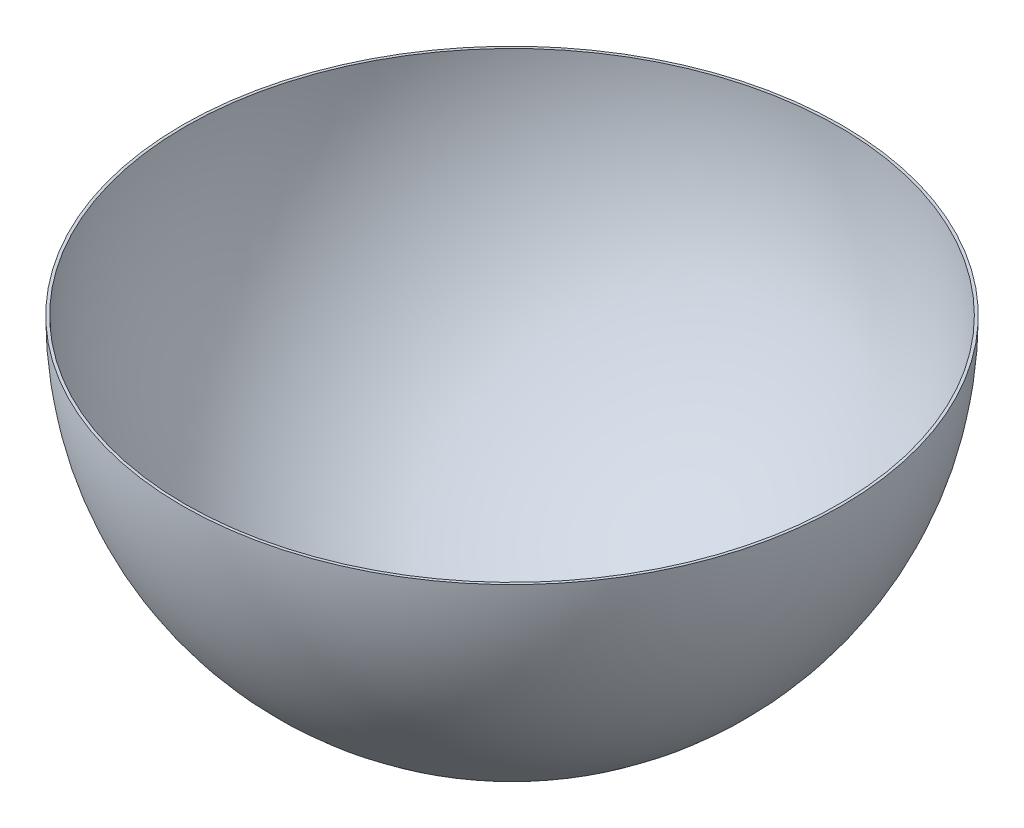
ISO-10303-21;
HEADER;
FILE_DESCRIPTION(('STEP AP214'),'2;1');
FILE_NAME('part.step','',(''),(''),'','','');
FILE_SCHEMA(('AUTOMOTIVE_DESIGN { 1 0 10303 214 1 1 1 1 }'));
ENDSEC;
DATA;
#1=APPLICATION_CONTEXT('core data for automotive mechanical design processes');
#2=APPLICATION_PROTOCOL_DEFINITION('international standard','automotive_design',2000,#1);
#3=PRODUCT_CONTEXT('',#1,'mechanical');
#4=PRODUCT('Part','Part','',(#3));
#5=PRODUCT_RELATED_PRODUCT_CATEGORY('part','',(#4));
#6=PRODUCT_DEFINITION_FORMATION('','',#4);
#7=PRODUCT_DEFINITION_CONTEXT('part definition',#1,'design');
#8=PRODUCT_DEFINITION('design','',#6,#7);
#9=PRODUCT_DEFINITION_SHAPE('','',#8);
#10=(LENGTH_UNIT() NAMED_UNIT(*) SI_UNIT(.MILLI.,.METRE.));
#11=(NAMED_UNIT(*) PLANE_ANGLE_UNIT() SI_UNIT($,.RADIAN.));
#12=(NAMED_UNIT(*) SI_UNIT($,.STERADIAN.) SOLID_ANGLE_UNIT());
#13=UNCERTAINTY_MEASURE_WITH_UNIT(LENGTH_MEASURE(1.E-05),#10,'distance_accuracy_value','');
#14=(GEOMETRIC_REPRESENTATION_CONTEXT(3) GLOBAL_UNCERTAINTY_ASSIGNED_CONTEXT((#13)) GLOBAL_UNIT_ASSIGNED_CONTEXT((#10,
#11,#12)) REPRESENTATION_CONTEXT('',''));
#15=CARTESIAN_POINT('',(0.,0.,0.));
#16=DIRECTION('',(0.,0.,1.));
#17=DIRECTION('',(1.,0.,0.));
#18=AXIS2_PLACEMENT_3D('',#15,#16,#17);
#19=CARTESIAN_POINT('',(0.,0.,0.));
#20=DIRECTION('',(0.,0.,1.));
#21=DIRECTION('',(1.,0.,0.));
#22=AXIS2_PLACEMENT_3D('',#19,#20,#21);
#23=SPHERICAL_SURFACE('',#22,228.6);
#24=CARTESIAN_POINT('',(0.,0.,0.));
#25=DIRECTION('',(0.,1.,0.));
#26=DIRECTION('',(-1.,0.,0.));
#27=AXIS2_PLACEMENT_3D('',#24,#25,#26);
#28=SPHERICAL_SURFACE('',#27,228.6);
#29=CARTESIAN_POINT('',(-1.59568929075942E-12,-228.511788536172,0.));
#30=DIRECTION('',(0.,1.,0.));
#31=DIRECTION('',(-1.,0.,0.));
#32=AXIS2_PLACEMENT_3D('',#29,#30,#31);
#33=CIRCLE('',#32,6.35);
#34=CARTESIAN_POINT('',(-6.35000000000159,-228.511788536171,0.));
#35=VERTEX_POINT('',#34);
#36=EDGE_CURVE('E53',#35,#35,#33,.T.);
#37=ORIENTED_EDGE('',*,*,#36,.T.);
#38=EDGE_LOOP('',(#37));
#39=FACE_BOUND('',#38,.T.);
#40=CARTESIAN_POINT('',(0.,0.,0.));
#41=DIRECTION('',(0.,-1.,0.));
#42=DIRECTION('',(0.,0.,1.));
#43=AXIS2_PLACEMENT_3D('',#40,#41,#42);
#44=CIRCLE('',#43,228.6);
#45=CARTESIAN_POINT('',(0.,0.,228.6));
#46=VERTEX_POINT('',#45);
#47=EDGE_CURVE('E49',#46,#46,#44,.F.);
#48=ORIENTED_EDGE('',*,*,#47,.F.);
#49=EDGE_LOOP('',(#48));
#50=FACE_BOUND('',#49,.T.);
#51=ADVANCED_FACE('F41',(#39,#50),#28,.T.);
#52=CARTESIAN_POINT('',(0.,0.,0.));
#53=DIRECTION('',(0.,0.,1.));
#54=DIRECTION('',(1.,0.,0.));
#55=AXIS2_PLACEMENT_3D('',#52,#53,#54);
#56=SPHERICAL_SURFACE('',#55,226.695);
#57=CARTESIAN_POINT('',(0.,0.,0.));
#58=DIRECTION('',(0.,1.,0.));
#59=DIRECTION('',(-1.,0.,0.));
#60=AXIS2_PLACEMENT_3D('',#57,#58,#59);
#61=SPHERICAL_SURFACE('',#60,226.695);
#62=CARTESIAN_POINT('',(-1.58238156855465E-12,-226.606046973597,0.));
#63=DIRECTION('',(0.,1.,0.));
#64=DIRECTION('',(-1.,0.,0.));
#65=AXIS2_PLACEMENT_3D('',#62,#63,#64);
#66=CIRCLE('',#65,6.35);
#67=CARTESIAN_POINT('',(-6.35000000000158,-226.606046973597,0.));
#68=VERTEX_POINT('',#67);
#69=EDGE_CURVE('E45',#68,#68,#66,.T.);
#70=ORIENTED_EDGE('',*,*,#69,.F.);
#71=EDGE_LOOP('',(#70));
#72=FACE_BOUND('',#71,.T.);
#73=CARTESIAN_POINT('',(0.,0.,0.));
#74=DIRECTION('',(0.,-1.,0.));
#75=DIRECTION('',(0.,0.,1.));
#76=AXIS2_PLACEMENT_3D('',#73,#74,#75);
#77=CIRCLE('',#76,226.695);
#78=CARTESIAN_POINT('',(0.,0.,226.695));
#79=VERTEX_POINT('',#78);
#80=EDGE_CURVE('E10',#79,#79,#77,.F.);
#81=ORIENTED_EDGE('',*,*,#80,.T.);
#82=EDGE_LOOP('',(#81));
#83=FACE_BOUND('',#82,.T.);
#84=ADVANCED_FACE('F43',(#72,#83),#61,.F.);
#85=CARTESIAN_POINT('',(0.,0.,0.));
#86=DIRECTION('',(0.,-1.,0.));
#87=DIRECTION('',(0.,0.,1.));
#88=AXIS2_PLACEMENT_3D('',#85,#86,#87);
#89=PLANE('',#88);
#90=ORIENTED_EDGE('',*,*,#47,.T.);
#91=EDGE_LOOP('',(#90));
#92=FACE_BOUND('',#91,.T.);
#93=ORIENTED_EDGE('',*,*,#80,.F.);
#94=EDGE_LOOP('',(#93));
#95=FACE_BOUND('',#94,.T.);
#96=ADVANCED_FACE('F66',(#92,#95),#89,.F.);
#97=CARTESIAN_POINT('',(0.,1.60982338570648E-12,0.));
#98=DIRECTION('',(0.,-1.,0.));
#99=DIRECTION('',(1.,0.,0.));
#100=AXIS2_PLACEMENT_3D('',#97,#98,#99);
#101=CYLINDRICAL_SURFACE('',#100,6.35);
#102=ORIENTED_EDGE('',*,*,#69,.T.);
#103=EDGE_LOOP('',(#102));
#104=FACE_BOUND('',#103,.T.);
#105=ORIENTED_EDGE('',*,*,#36,.F.);
#106=EDGE_LOOP('',(#105));
#107=FACE_BOUND('',#106,.T.);
#108=ADVANCED_FACE('F62',(#104,#107),#101,.F.);
#109=CLOSED_SHELL('',(#51,#84,#96,#108));
#110=MANIFOLD_SOLID_BREP('B2',#109);
#111=ADVANCED_BREP_SHAPE_REPRESENTATION('',(#18,#110),#14);
#112=SHAPE_DEFINITION_REPRESENTATION(#9,#111);
ENDSEC;
END-ISO-10303-21;
